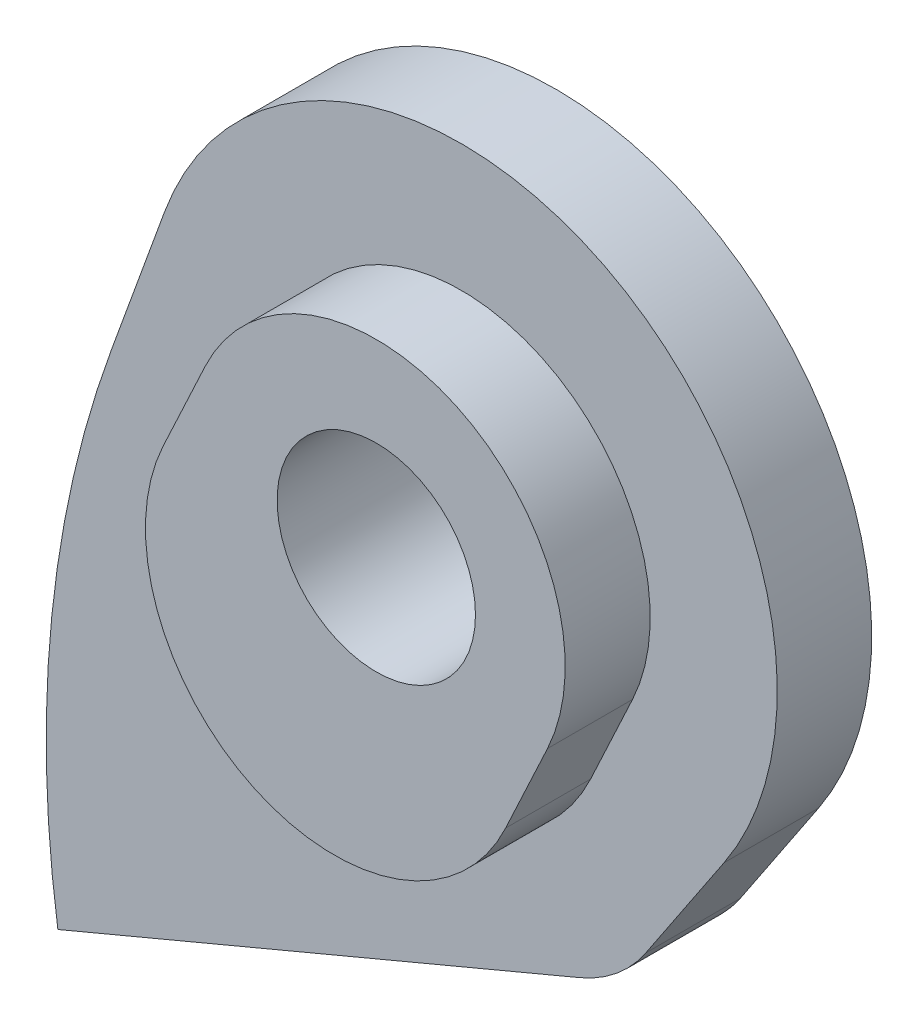
ISO-10303-21;
HEADER;
FILE_DESCRIPTION(('STEP AP214'),'2;1');
FILE_NAME('part.step','',(''),(''),'','','');
FILE_SCHEMA(('AUTOMOTIVE_DESIGN { 1 0 10303 214 1 1 1 1 }'));
ENDSEC;
DATA;
#1=APPLICATION_CONTEXT('core data for automotive mechanical design processes');
#2=APPLICATION_PROTOCOL_DEFINITION('international standard','automotive_design',2000,#1);
#3=PRODUCT_CONTEXT('',#1,'mechanical');
#4=PRODUCT('Part','Part','',(#3));
#5=PRODUCT_RELATED_PRODUCT_CATEGORY('part','',(#4));
#6=PRODUCT_DEFINITION_FORMATION('','',#4);
#7=PRODUCT_DEFINITION_CONTEXT('part definition',#1,'design');
#8=PRODUCT_DEFINITION('design','',#6,#7);
#9=PRODUCT_DEFINITION_SHAPE('','',#8);
#10=(LENGTH_UNIT() NAMED_UNIT(*) SI_UNIT(.MILLI.,.METRE.));
#11=(NAMED_UNIT(*) PLANE_ANGLE_UNIT() SI_UNIT($,.RADIAN.));
#12=(NAMED_UNIT(*) SI_UNIT($,.STERADIAN.) SOLID_ANGLE_UNIT());
#13=UNCERTAINTY_MEASURE_WITH_UNIT(LENGTH_MEASURE(1.E-05),#10,'distance_accuracy_value','');
#14=(GEOMETRIC_REPRESENTATION_CONTEXT(3) GLOBAL_UNCERTAINTY_ASSIGNED_CONTEXT((#13)) GLOBAL_UNIT_ASSIGNED_CONTEXT((#10,
#11,#12)) REPRESENTATION_CONTEXT('',''));
#15=CARTESIAN_POINT('',(0.,0.,0.));
#16=DIRECTION('',(0.,0.,1.));
#17=DIRECTION('',(1.,0.,0.));
#18=AXIS2_PLACEMENT_3D('',#15,#16,#17);
#19=CARTESIAN_POINT('',(0.11468761398859,80.1325343968941,0.));
#20=DIRECTION('',(0.,0.,1.));
#21=DIRECTION('',(1.,0.,0.));
#22=AXIS2_PLACEMENT_3D('',#19,#20,#21);
#23=PLANE('',#22);
#24=CARTESIAN_POINT('',(14.2795120747355,71.4970986035797,0.));
#25=DIRECTION('',(0.,0.,1.));
#26=DIRECTION('',(1.,0.,0.));
#27=AXIS2_PLACEMENT_3D('',#24,#25,#26);
#28=CIRCLE('',#27,22.9540740082007);
#29=CARTESIAN_POINT('',(-7.29026188774433,79.3478542857725,0.));
#30=VERTEX_POINT('',#29);
#31=CARTESIAN_POINT('',(-8.42769677737512,68.1396919078421,0.));
#32=VERTEX_POINT('',#31);
#33=EDGE_CURVE('E154',#30,#32,#28,.T.);
#34=ORIENTED_EDGE('',*,*,#33,.T.);
#35=DIRECTION('',(-0.921960246209325,-0.387284526426812,0.));
#36=VECTOR('',#35,1.);
#37=CARTESIAN_POINT('',(2.62584420432856,72.7829131335289,0.));
#38=LINE('',#37,#36);
#39=CARTESIAN_POINT('',(2.62584420432857,72.7829131335288,0.));
#40=VERTEX_POINT('',#39);
#41=EDGE_CURVE('E178',#40,#32,#38,.T.);
#42=ORIENTED_EDGE('',*,*,#41,.F.);
#43=CARTESIAN_POINT('',(1.41064938117233,75.6757767567832,0.));
#44=DIRECTION('',(0.,0.,-1.));
#45=DIRECTION('',(-1.,0.,0.));
#46=AXIS2_PLACEMENT_3D('',#43,#44,#45);
#47=CIRCLE('',#46,3.13773140994799);
#48=CARTESIAN_POINT('',(4.02035151590427,73.933705240183,0.));
#49=VERTEX_POINT('',#48);
#50=EDGE_CURVE('E173',#49,#40,#47,.T.);
#51=ORIENTED_EDGE('',*,*,#50,.F.);
#52=DIRECTION('',(0.555200968150768,0.831716228628761,0.));
#53=VECTOR('',#52,1.);
#54=CARTESIAN_POINT('',(4.02035151590429,73.933705240183,0.));
#55=LINE('',#54,#53);
#56=CARTESIAN_POINT('',(5.67886918351501,76.4182399199654,0.));
#57=VERTEX_POINT('',#56);
#58=EDGE_CURVE('E147',#49,#57,#55,.T.);
#59=ORIENTED_EDGE('',*,*,#58,.T.);
#60=CARTESIAN_POINT('',(0.11468761398859,80.1325343968941,0.));
#61=DIRECTION('',(0.,0.,1.));
#62=DIRECTION('',(1.,0.,0.));
#63=AXIS2_PLACEMENT_3D('',#60,#61,#62);
#64=CIRCLE('',#63,6.69000000000006);
#65=CARTESIAN_POINT('',(-6.17185601906935,82.4206491557424,0.));
#66=VERTEX_POINT('',#65);
#67=EDGE_CURVE('E149',#57,#66,#64,.T.);
#68=ORIENTED_EDGE('',*,*,#67,.T.);
#69=DIRECTION('',(-0.342020143325666,-0.939692620785909,0.));
#70=VECTOR('',#69,1.);
#71=CARTESIAN_POINT('',(-6.1718560190694,82.4206491557424,0.));
#72=LINE('',#71,#70);
#73=EDGE_CURVE('E155',#66,#30,#72,.T.);
#74=ORIENTED_EDGE('',*,*,#73,.T.);
#75=EDGE_LOOP('',(#34,#42,#51,#59,#68,#74));
#76=FACE_BOUND('',#75,.T.);
#77=DIRECTION('',(-0.4226182617407,-0.90630778703665,0.));
#78=VECTOR('',#77,1.);
#79=CARTESIAN_POINT('',(-3.51054353415801,81.8230074438569,0.));
#80=LINE('',#79,#78);
#81=CARTESIAN_POINT('',(-3.51054353415801,81.8230074438569,0.));
#82=VERTEX_POINT('',#81);
#83=CARTESIAN_POINT('',(-4.39804188381347,79.9197610910799,0.));
#84=VERTEX_POINT('',#83);
#85=EDGE_CURVE('E241',#82,#84,#80,.T.);
#86=ORIENTED_EDGE('',*,*,#85,.F.);
#87=CARTESIAN_POINT('',(0.114687613988609,80.1325343968941,0.));
#88=DIRECTION('',(0.,0.,1.));
#89=DIRECTION('',(1.,0.,0.));
#90=AXIS2_PLACEMENT_3D('',#87,#88,#89);
#91=CIRCLE('',#90,4.00000000000001);
#92=CARTESIAN_POINT('',(3.73991876213519,78.4420613499313,0.));
#93=VERTEX_POINT('',#92);
#94=EDGE_CURVE('E145',#93,#82,#91,.T.);
#95=ORIENTED_EDGE('',*,*,#94,.F.);
#96=DIRECTION('',(0.4226182617407,0.90630778703665,0.));
#97=VECTOR('',#96,1.);
#98=CARTESIAN_POINT('',(3.73991876213519,78.4420613499313,0.));
#99=LINE('',#98,#97);
#100=CARTESIAN_POINT('',(2.85242041247973,76.5388149971543,0.));
#101=VERTEX_POINT('',#100);
#102=EDGE_CURVE('E141',#101,#93,#99,.T.);
#103=ORIENTED_EDGE('',*,*,#102,.F.);
#104=CARTESIAN_POINT('',(-0.772810735666862,78.2292880441171,0.));
#105=DIRECTION('',(0.,0.,1.));
#106=DIRECTION('',(1.,0.,0.));
#107=AXIS2_PLACEMENT_3D('',#104,#105,#106);
#108=CIRCLE('',#107,4.00000000000001);
#109=EDGE_CURVE('E243',#84,#101,#108,.T.);
#110=ORIENTED_EDGE('',*,*,#109,.F.);
#111=EDGE_LOOP('',(#86,#95,#103,#110));
#112=FACE_BOUND('',#111,.T.);
#113=ADVANCED_FACE('F33',(#76,#112),#23,.T.);
#114=CARTESIAN_POINT('',(-8.01359795678153,76.9658058271043,-5.));
#115=DIRECTION('',(-0.921960246209324,-0.387284526426815,0.));
#116=DIRECTION('',(0.387284526426815,-0.921960246209324,0.));
#117=AXIS2_PLACEMENT_3D('',#114,#115,#116);
#118=PLANE('',#117);
#119=DIRECTION('',(0.387284526426815,-0.921960246209324,0.));
#120=VECTOR('',#119,1.);
#121=CARTESIAN_POINT('',(-8.01359795678153,76.9658058271043,-2.));
#122=LINE('',#121,#120);
#123=CARTESIAN_POINT('',(-8.01359795678153,76.9658058271043,-2.));
#124=VERTEX_POINT('',#123);
#125=CARTESIAN_POINT('',(-4.92424784177968,69.611373108264,-2.));
#126=VERTEX_POINT('',#125);
#127=EDGE_CURVE('E56',#124,#126,#122,.T.);
#128=ORIENTED_EDGE('',*,*,#127,.T.);
#129=DIRECTION('',(0.,0.,1.));
#130=VECTOR('',#129,1.);
#131=CARTESIAN_POINT('',(-4.92424784177968,69.611373108264,-5.));
#132=LINE('',#131,#130);
#133=CARTESIAN_POINT('',(-4.92424784177968,69.611373108264,-5.));
#134=VERTEX_POINT('',#133);
#135=EDGE_CURVE('E166',#134,#126,#132,.T.);
#136=ORIENTED_EDGE('',*,*,#135,.F.);
#137=DIRECTION('',(0.387284526426815,-0.921960246209324,0.));
#138=VECTOR('',#137,1.);
#139=CARTESIAN_POINT('',(-8.01359795678153,76.9658058271043,-5.));
#140=LINE('',#139,#138);
#141=CARTESIAN_POINT('',(-8.01359795678153,76.9658058271043,-5.));
#142=VERTEX_POINT('',#141);
#143=EDGE_CURVE('E164',#142,#134,#140,.T.);
#144=ORIENTED_EDGE('',*,*,#143,.F.);
#145=DIRECTION('',(0.,0.,1.));
#146=VECTOR('',#145,1.);
#147=CARTESIAN_POINT('',(-8.01359795678153,76.9658058271043,-5.));
#148=LINE('',#147,#146);
#149=EDGE_CURVE('E170',#142,#124,#148,.T.);
#150=ORIENTED_EDGE('',*,*,#149,.T.);
#151=EDGE_LOOP('',(#128,#136,#144,#150));
#152=FACE_BOUND('',#151,.T.);
#153=ADVANCED_FACE('F230',(#152),#118,.F.);
#154=CARTESIAN_POINT('',(14.2795120747355,71.4970986035797,-5.));
#155=DIRECTION('',(0.,0.,1.));
#156=DIRECTION('',(1.,0.,0.));
#157=AXIS2_PLACEMENT_3D('',#154,#155,#156);
#158=PLANE('',#157);
#159=DIRECTION('',(-0.921960246209326,-0.38728452642681,0.));
#160=VECTOR('',#159,1.);
#161=CARTESIAN_POINT('',(-4.92424784177968,69.611373108264,-5.));
#162=LINE('',#161,#160);
#163=CARTESIAN_POINT('',(-8.42769677737511,68.1396919078421,-5.));
#164=VERTEX_POINT('',#163);
#165=EDGE_CURVE('E159',#134,#164,#162,.T.);
#166=ORIENTED_EDGE('',*,*,#165,.T.);
#167=CARTESIAN_POINT('',(14.2795120747355,71.4970986035797,-5.));
#168=DIRECTION('',(0.,0.,-1.));
#169=DIRECTION('',(1.,0.,0.));
#170=AXIS2_PLACEMENT_3D('',#167,#168,#169);
#171=CIRCLE('',#170,22.9540740082007);
#172=EDGE_CURVE('E162',#164,#142,#171,.T.);
#173=ORIENTED_EDGE('',*,*,#172,.T.);
#174=ORIENTED_EDGE('',*,*,#143,.T.);
#175=EDGE_LOOP('',(#166,#173,#174));
#176=FACE_BOUND('',#175,.T.);
#177=ADVANCED_FACE('F281',(#176),#158,.F.);
#178=CARTESIAN_POINT('',(0.11468761398859,80.1325343968941,-2.));
#179=DIRECTION('',(0.,0.,1.));
#180=DIRECTION('',(1.,0.,0.));
#181=AXIS2_PLACEMENT_3D('',#178,#179,#180);
#182=PLANE('',#181);
#183=CARTESIAN_POINT('',(0.11468761398859,80.1325343968941,-2.));
#184=DIRECTION('',(0.,0.,1.));
#185=DIRECTION('',(1.,0.,0.));
#186=AXIS2_PLACEMENT_3D('',#183,#184,#185);
#187=CIRCLE('',#186,2.10000000000001);
#188=CARTESIAN_POINT('',(2.2146876139886,80.1325343968941,-2.));
#189=VERTEX_POINT('',#188);
#190=EDGE_CURVE('E246',#189,#189,#187,.T.);
#191=ORIENTED_EDGE('',*,*,#190,.T.);
#192=EDGE_LOOP('',(#191));
#193=FACE_BOUND('',#192,.T.);
#194=ORIENTED_EDGE('',*,*,#127,.F.);
#195=CARTESIAN_POINT('',(14.2795120747355,71.4970986035797,-2.));
#196=DIRECTION('',(0.,0.,-1.));
#197=DIRECTION('',(-1.,0.,0.));
#198=AXIS2_PLACEMENT_3D('',#195,#196,#197);
#199=CIRCLE('',#198,22.9540740082007);
#200=CARTESIAN_POINT('',(-7.29026188774433,79.3478542857725,-2.));
#201=VERTEX_POINT('',#200);
#202=EDGE_CURVE('E184',#124,#201,#199,.T.);
#203=ORIENTED_EDGE('',*,*,#202,.T.);
#204=DIRECTION('',(0.342020143325687,0.939692620785902,0.));
#205=VECTOR('',#204,1.);
#206=CARTESIAN_POINT('',(-6.17185601906934,82.4206491557424,-2.));
#207=LINE('',#206,#205);
#208=CARTESIAN_POINT('',(-6.17185601906934,82.4206491557424,-2.));
#209=VERTEX_POINT('',#208);
#210=EDGE_CURVE('E186',#201,#209,#207,.T.);
#211=ORIENTED_EDGE('',*,*,#210,.T.);
#212=CARTESIAN_POINT('',(0.11468761398859,80.1325343968941,-2.));
#213=DIRECTION('',(0.,0.,-1.));
#214=DIRECTION('',(1.,0.,0.));
#215=AXIS2_PLACEMENT_3D('',#212,#213,#214);
#216=CIRCLE('',#215,6.69000000000002);
#217=CARTESIAN_POINT('',(5.67886918351501,76.4182399199654,-2.));
#218=VERTEX_POINT('',#217);
#219=EDGE_CURVE('E174',#209,#218,#216,.T.);
#220=ORIENTED_EDGE('',*,*,#219,.T.);
#221=DIRECTION('',(-0.555200968150769,-0.83171622862876,0.));
#222=VECTOR('',#221,1.);
#223=CARTESIAN_POINT('',(5.67886918351501,76.4182399199654,-2.));
#224=LINE('',#223,#222);
#225=CARTESIAN_POINT('',(4.02035151590429,73.933705240183,-2.));
#226=VERTEX_POINT('',#225);
#227=EDGE_CURVE('E177',#218,#226,#224,.T.);
#228=ORIENTED_EDGE('',*,*,#227,.T.);
#229=CARTESIAN_POINT('',(1.41064938117233,75.6757767567832,-2.));
#230=DIRECTION('',(0.,0.,-1.));
#231=DIRECTION('',(-1.,0.,0.));
#232=AXIS2_PLACEMENT_3D('',#229,#230,#231);
#233=CIRCLE('',#232,3.13773140994799);
#234=CARTESIAN_POINT('',(2.62584420432857,72.7829131335288,-2.));
#235=VERTEX_POINT('',#234);
#236=EDGE_CURVE('E180',#226,#235,#233,.T.);
#237=ORIENTED_EDGE('',*,*,#236,.T.);
#238=DIRECTION('',(-0.921960246209325,-0.387284526426812,0.));
#239=VECTOR('',#238,1.);
#240=CARTESIAN_POINT('',(2.62584420432856,72.7829131335289,-2.));
#241=LINE('',#240,#239);
#242=EDGE_CURVE('E182',#235,#126,#241,.T.);
#243=ORIENTED_EDGE('',*,*,#242,.T.);
#244=EDGE_LOOP('',(#194,#203,#211,#220,#228,#237,#243));
#245=FACE_BOUND('',#244,.T.);
#246=ADVANCED_FACE('F212',(#193,#245),#182,.F.);
#247=CARTESIAN_POINT('',(1.41064938117233,75.6757767567832,-2.));
#248=DIRECTION('',(0.,0.,1.));
#249=DIRECTION('',(1.,0.,0.));
#250=AXIS2_PLACEMENT_3D('',#247,#248,#249);
#251=CYLINDRICAL_SURFACE('',#250,3.13773140994799);
#252=ORIENTED_EDGE('',*,*,#50,.T.);
#253=DIRECTION('',(0.,0.,1.));
#254=VECTOR('',#253,1.);
#255=CARTESIAN_POINT('',(2.62584420432857,72.7829131335288,-2.));
#256=LINE('',#255,#254);
#257=EDGE_CURVE('E196',#235,#40,#256,.T.);
#258=ORIENTED_EDGE('',*,*,#257,.F.);
#259=ORIENTED_EDGE('',*,*,#236,.F.);
#260=DIRECTION('',(0.,0.,1.));
#261=VECTOR('',#260,1.);
#262=CARTESIAN_POINT('',(4.02035151590429,73.933705240183,-2.));
#263=LINE('',#262,#261);
#264=EDGE_CURVE('E199',#226,#49,#263,.T.);
#265=ORIENTED_EDGE('',*,*,#264,.T.);
#266=EDGE_LOOP('',(#252,#258,#259,#265));
#267=FACE_BOUND('',#266,.T.);
#268=ADVANCED_FACE('F223',(#267),#251,.T.);
#269=CARTESIAN_POINT('',(2.62584420432856,72.7829131335289,-2.));
#270=DIRECTION('',(-0.387284526426812,0.921960246209325,0.));
#271=DIRECTION('',(-0.921960246209325,-0.387284526426812,0.));
#272=AXIS2_PLACEMENT_3D('',#269,#270,#271);
#273=PLANE('',#272);
#274=ORIENTED_EDGE('',*,*,#41,.T.);
#275=DIRECTION('',(0.,0.,1.));
#276=VECTOR('',#275,1.);
#277=CARTESIAN_POINT('',(-8.42769677737511,68.1396919078421,-2.));
#278=LINE('',#277,#276);
#279=EDGE_CURVE('E189',#164,#32,#278,.T.);
#280=ORIENTED_EDGE('',*,*,#279,.F.);
#281=ORIENTED_EDGE('',*,*,#165,.F.);
#282=ORIENTED_EDGE('',*,*,#135,.T.);
#283=ORIENTED_EDGE('',*,*,#242,.F.);
#284=ORIENTED_EDGE('',*,*,#257,.T.);
#285=EDGE_LOOP('',(#274,#280,#281,#282,#283,#284));
#286=FACE_BOUND('',#285,.T.);
#287=ADVANCED_FACE('F225',(#286),#273,.F.);
#288=CARTESIAN_POINT('',(14.2795120747355,71.4970986035797,11.));
#289=DIRECTION('',(0.,0.,-1.));
#290=DIRECTION('',(-1.,0.,0.));
#291=AXIS2_PLACEMENT_3D('',#288,#289,#290);
#292=CYLINDRICAL_SURFACE('',#291,22.9540740082007);
#293=ORIENTED_EDGE('',*,*,#33,.F.);
#294=DIRECTION('',(0.,0.,-1.));
#295=VECTOR('',#294,1.);
#296=CARTESIAN_POINT('',(-7.29026188774433,79.3478542857725,11.));
#297=LINE('',#296,#295);
#298=EDGE_CURVE('E202',#30,#201,#297,.T.);
#299=ORIENTED_EDGE('',*,*,#298,.T.);
#300=ORIENTED_EDGE('',*,*,#202,.F.);
#301=ORIENTED_EDGE('',*,*,#149,.F.);
#302=ORIENTED_EDGE('',*,*,#172,.F.);
#303=ORIENTED_EDGE('',*,*,#279,.T.);
#304=EDGE_LOOP('',(#293,#299,#300,#301,#302,#303));
#305=FACE_BOUND('',#304,.T.);
#306=ADVANCED_FACE('F235',(#305),#292,.T.);
#307=CARTESIAN_POINT('',(-6.1718560190694,82.4206491557424,11.));
#308=DIRECTION('',(0.939692620785909,-0.342020143325666,0.));
#309=DIRECTION('',(0.342020143325666,0.939692620785909,0.));
#310=AXIS2_PLACEMENT_3D('',#307,#308,#309);
#311=PLANE('',#310);
#312=ORIENTED_EDGE('',*,*,#73,.F.);
#313=DIRECTION('',(0.,0.,-1.));
#314=VECTOR('',#313,1.);
#315=CARTESIAN_POINT('',(-6.17185601906935,82.4206491557424,11.));
#316=LINE('',#315,#314);
#317=EDGE_CURVE('E41',#66,#209,#316,.T.);
#318=ORIENTED_EDGE('',*,*,#317,.T.);
#319=ORIENTED_EDGE('',*,*,#210,.F.);
#320=ORIENTED_EDGE('',*,*,#298,.F.);
#321=EDGE_LOOP('',(#312,#318,#319,#320));
#322=FACE_BOUND('',#321,.T.);
#323=ADVANCED_FACE('F207',(#322),#311,.F.);
#324=CARTESIAN_POINT('',(0.11468761398859,80.1325343968941,11.));
#325=DIRECTION('',(0.,0.,-1.));
#326=DIRECTION('',(-1.,0.,0.));
#327=AXIS2_PLACEMENT_3D('',#324,#325,#326);
#328=CYLINDRICAL_SURFACE('',#327,6.69000000000006);
#329=ORIENTED_EDGE('',*,*,#317,.F.);
#330=ORIENTED_EDGE('',*,*,#67,.F.);
#331=DIRECTION('',(0.,0.,-1.));
#332=VECTOR('',#331,1.);
#333=CARTESIAN_POINT('',(5.67886918351501,76.4182399199654,11.));
#334=LINE('',#333,#332);
#335=EDGE_CURVE('E11',#57,#218,#334,.T.);
#336=ORIENTED_EDGE('',*,*,#335,.T.);
#337=ORIENTED_EDGE('',*,*,#219,.F.);
#338=EDGE_LOOP('',(#329,#330,#336,#337));
#339=FACE_BOUND('',#338,.T.);
#340=ADVANCED_FACE('F213',(#339),#328,.T.);
#341=CARTESIAN_POINT('',(4.02035151590429,73.933705240183,11.));
#342=DIRECTION('',(-0.831716228628761,0.555200968150768,0.));
#343=DIRECTION('',(-0.555200968150768,-0.831716228628761,0.));
#344=AXIS2_PLACEMENT_3D('',#341,#342,#343);
#345=PLANE('',#344);
#346=ORIENTED_EDGE('',*,*,#58,.F.);
#347=ORIENTED_EDGE('',*,*,#264,.F.);
#348=ORIENTED_EDGE('',*,*,#227,.F.);
#349=ORIENTED_EDGE('',*,*,#335,.F.);
#350=EDGE_LOOP('',(#346,#347,#348,#349));
#351=FACE_BOUND('',#350,.T.);
#352=ADVANCED_FACE('F35',(#351),#345,.F.);
#353=CARTESIAN_POINT('',(0.114687613988609,80.1325343968941,1.8));
#354=DIRECTION('',(0.,0.,-1.));
#355=DIRECTION('',(-1.,0.,0.));
#356=AXIS2_PLACEMENT_3D('',#353,#354,#355);
#357=CYLINDRICAL_SURFACE('',#356,4.00000000000001);
#358=ORIENTED_EDGE('',*,*,#94,.T.);
#359=DIRECTION('',(0.,0.,-1.));
#360=VECTOR('',#359,1.);
#361=CARTESIAN_POINT('',(-3.51054353415801,81.8230074438569,1.8));
#362=LINE('',#361,#360);
#363=CARTESIAN_POINT('',(-3.51054353415801,81.8230074438569,1.8));
#364=VERTEX_POINT('',#363);
#365=EDGE_CURVE('E126',#364,#82,#362,.T.);
#366=ORIENTED_EDGE('',*,*,#365,.F.);
#367=CARTESIAN_POINT('',(0.114687613988609,80.1325343968941,1.8));
#368=DIRECTION('',(0.,0.,1.));
#369=DIRECTION('',(1.,0.,0.));
#370=AXIS2_PLACEMENT_3D('',#367,#368,#369);
#371=CIRCLE('',#370,4.00000000000001);
#372=CARTESIAN_POINT('',(3.73991876213519,78.4420613499313,1.8));
#373=VERTEX_POINT('',#372);
#374=EDGE_CURVE('E133',#373,#364,#371,.T.);
#375=ORIENTED_EDGE('',*,*,#374,.F.);
#376=DIRECTION('',(0.,0.,-1.));
#377=VECTOR('',#376,1.);
#378=CARTESIAN_POINT('',(3.73991876213519,78.4420613499313,1.8));
#379=LINE('',#378,#377);
#380=EDGE_CURVE('E251',#373,#93,#379,.T.);
#381=ORIENTED_EDGE('',*,*,#380,.T.);
#382=EDGE_LOOP('',(#358,#366,#375,#381));
#383=FACE_BOUND('',#382,.T.);
#384=ADVANCED_FACE('F143',(#383),#357,.T.);
#385=CARTESIAN_POINT('',(-3.51054353415801,81.8230074438569,1.8));
#386=DIRECTION('',(0.90630778703665,-0.4226182617407,0.));
#387=DIRECTION('',(0.4226182617407,0.90630778703665,0.));
#388=AXIS2_PLACEMENT_3D('',#385,#386,#387);
#389=PLANE('',#388);
#390=ORIENTED_EDGE('',*,*,#85,.T.);
#391=DIRECTION('',(0.,0.,-1.));
#392=VECTOR('',#391,1.);
#393=CARTESIAN_POINT('',(-4.39804188381347,79.9197610910799,1.8));
#394=LINE('',#393,#392);
#395=CARTESIAN_POINT('',(-4.39804188381347,79.9197610910799,1.8));
#396=VERTEX_POINT('',#395);
#397=EDGE_CURVE('E129',#396,#84,#394,.T.);
#398=ORIENTED_EDGE('',*,*,#397,.F.);
#399=DIRECTION('',(-0.4226182617407,-0.90630778703665,0.));
#400=VECTOR('',#399,1.);
#401=CARTESIAN_POINT('',(-3.51054353415801,81.8230074438569,1.8));
#402=LINE('',#401,#400);
#403=EDGE_CURVE('E122',#364,#396,#402,.T.);
#404=ORIENTED_EDGE('',*,*,#403,.F.);
#405=ORIENTED_EDGE('',*,*,#365,.T.);
#406=EDGE_LOOP('',(#390,#398,#404,#405));
#407=FACE_BOUND('',#406,.T.);
#408=ADVANCED_FACE('F124',(#407),#389,.F.);
#409=CARTESIAN_POINT('',(-0.772810735666862,78.2292880441171,1.8));
#410=DIRECTION('',(0.,0.,-1.));
#411=DIRECTION('',(-1.,0.,0.));
#412=AXIS2_PLACEMENT_3D('',#409,#410,#411);
#413=CYLINDRICAL_SURFACE('',#412,4.00000000000001);
#414=ORIENTED_EDGE('',*,*,#109,.T.);
#415=DIRECTION('',(0.,0.,-1.));
#416=VECTOR('',#415,1.);
#417=CARTESIAN_POINT('',(2.85242041247973,76.5388149971543,1.8));
#418=LINE('',#417,#416);
#419=CARTESIAN_POINT('',(2.85242041247973,76.5388149971543,1.8));
#420=VERTEX_POINT('',#419);
#421=EDGE_CURVE('E48',#420,#101,#418,.T.);
#422=ORIENTED_EDGE('',*,*,#421,.F.);
#423=CARTESIAN_POINT('',(-0.772810735666862,78.2292880441171,1.8));
#424=DIRECTION('',(0.,0.,1.));
#425=DIRECTION('',(1.,0.,0.));
#426=AXIS2_PLACEMENT_3D('',#423,#424,#425);
#427=CIRCLE('',#426,4.00000000000001);
#428=EDGE_CURVE('E132',#396,#420,#427,.T.);
#429=ORIENTED_EDGE('',*,*,#428,.F.);
#430=ORIENTED_EDGE('',*,*,#397,.T.);
#431=EDGE_LOOP('',(#414,#422,#429,#430));
#432=FACE_BOUND('',#431,.T.);
#433=ADVANCED_FACE('F271',(#432),#413,.T.);
#434=CARTESIAN_POINT('',(3.73991876213519,78.4420613499313,1.8));
#435=DIRECTION('',(-0.90630778703665,0.4226182617407,0.));
#436=DIRECTION('',(-0.4226182617407,-0.90630778703665,0.));
#437=AXIS2_PLACEMENT_3D('',#434,#435,#436);
#438=PLANE('',#437);
#439=ORIENTED_EDGE('',*,*,#102,.T.);
#440=ORIENTED_EDGE('',*,*,#380,.F.);
#441=DIRECTION('',(0.4226182617407,0.90630778703665,0.));
#442=VECTOR('',#441,1.);
#443=CARTESIAN_POINT('',(3.73991876213519,78.4420613499313,1.8));
#444=LINE('',#443,#442);
#445=EDGE_CURVE('E137',#420,#373,#444,.T.);
#446=ORIENTED_EDGE('',*,*,#445,.F.);
#447=ORIENTED_EDGE('',*,*,#421,.T.);
#448=EDGE_LOOP('',(#439,#440,#446,#447));
#449=FACE_BOUND('',#448,.T.);
#450=ADVANCED_FACE('F264',(#449),#438,.F.);
#451=CARTESIAN_POINT('',(0.114687613988609,80.1325343968941,1.8));
#452=DIRECTION('',(0.,0.,1.));
#453=DIRECTION('',(1.,0.,0.));
#454=AXIS2_PLACEMENT_3D('',#451,#452,#453);
#455=PLANE('',#454);
#456=CARTESIAN_POINT('',(0.11468761398859,80.1325343968941,1.8));
#457=DIRECTION('',(0.,0.,1.));
#458=DIRECTION('',(1.,0.,0.));
#459=AXIS2_PLACEMENT_3D('',#456,#457,#458);
#460=CIRCLE('',#459,2.10000000000001);
#461=CARTESIAN_POINT('',(2.2146876139886,80.1325343968941,1.8));
#462=VERTEX_POINT('',#461);
#463=EDGE_CURVE('E256',#462,#462,#460,.T.);
#464=ORIENTED_EDGE('',*,*,#463,.F.);
#465=EDGE_LOOP('',(#464));
#466=FACE_BOUND('',#465,.T.);
#467=ORIENTED_EDGE('',*,*,#374,.T.);
#468=ORIENTED_EDGE('',*,*,#403,.T.);
#469=ORIENTED_EDGE('',*,*,#428,.T.);
#470=ORIENTED_EDGE('',*,*,#445,.T.);
#471=EDGE_LOOP('',(#467,#468,#469,#470));
#472=FACE_BOUND('',#471,.T.);
#473=ADVANCED_FACE('F136',(#466,#472),#455,.T.);
#474=CARTESIAN_POINT('',(0.11468761398859,80.1325343968941,-5.));
#475=DIRECTION('',(0.,0.,1.));
#476=DIRECTION('',(1.,0.,0.));
#477=AXIS2_PLACEMENT_3D('',#474,#475,#476);
#478=CYLINDRICAL_SURFACE('',#477,2.10000000000001);
#479=ORIENTED_EDGE('',*,*,#463,.T.);
#480=EDGE_LOOP('',(#479));
#481=FACE_BOUND('',#480,.T.);
#482=ORIENTED_EDGE('',*,*,#190,.F.);
#483=EDGE_LOOP('',(#482));
#484=FACE_BOUND('',#483,.T.);
#485=ADVANCED_FACE('F260',(#481,#484),#478,.F.);
#486=CLOSED_SHELL('',(#113,#153,#177,#246,#268,#287,#306,#323,#340,#352,#384,#408,#433,#450,
#473,#485));
#487=MANIFOLD_SOLID_BREP('B2',#486);
#488=ADVANCED_BREP_SHAPE_REPRESENTATION('',(#18,#487),#14);
#489=SHAPE_DEFINITION_REPRESENTATION(#9,#488);
ENDSEC;
END-ISO-10303-21;
